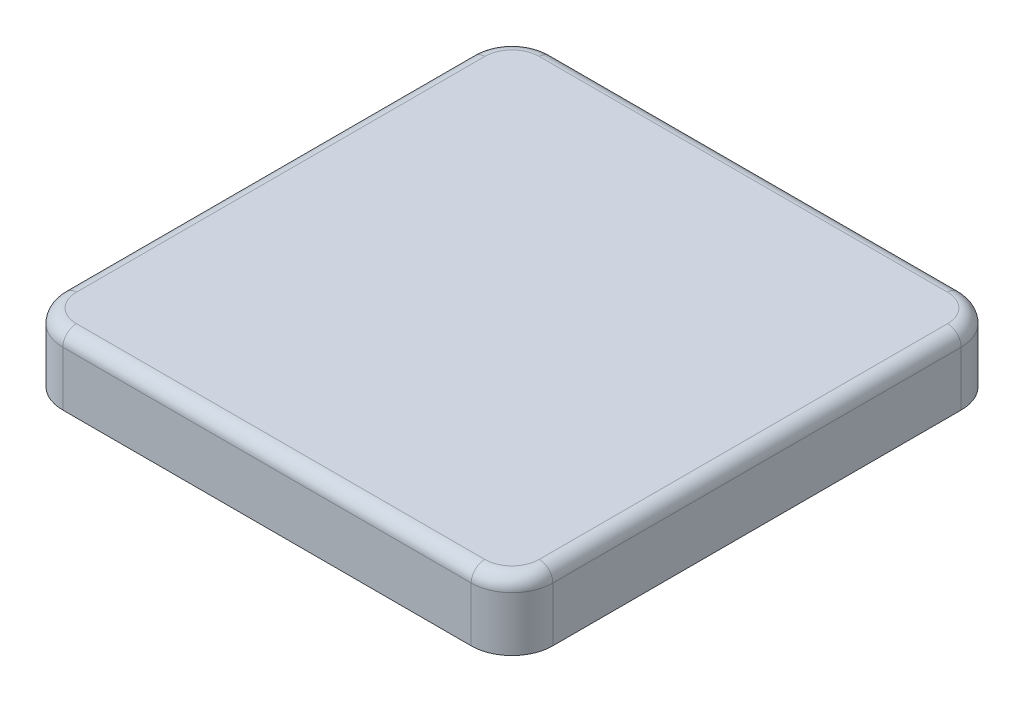
ISO-10303-21;
HEADER;
FILE_DESCRIPTION(('STEP AP214'),'2;1');
FILE_NAME('part.step','',(''),(''),'','','');
FILE_SCHEMA(('AUTOMOTIVE_DESIGN { 1 0 10303 214 1 1 1 1 }'));
ENDSEC;
DATA;
#1=APPLICATION_CONTEXT('core data for automotive mechanical design processes');
#2=APPLICATION_PROTOCOL_DEFINITION('international standard','automotive_design',2000,#1);
#3=PRODUCT_CONTEXT('',#1,'mechanical');
#4=PRODUCT('Part','Part','',(#3));
#5=PRODUCT_RELATED_PRODUCT_CATEGORY('part','',(#4));
#6=PRODUCT_DEFINITION_FORMATION('','',#4);
#7=PRODUCT_DEFINITION_CONTEXT('part definition',#1,'design');
#8=PRODUCT_DEFINITION('design','',#6,#7);
#9=PRODUCT_DEFINITION_SHAPE('','',#8);
#10=(LENGTH_UNIT() NAMED_UNIT(*) SI_UNIT(.MILLI.,.METRE.));
#11=(NAMED_UNIT(*) PLANE_ANGLE_UNIT() SI_UNIT($,.RADIAN.));
#12=(NAMED_UNIT(*) SI_UNIT($,.STERADIAN.) SOLID_ANGLE_UNIT());
#13=UNCERTAINTY_MEASURE_WITH_UNIT(LENGTH_MEASURE(1.E-05),#10,'distance_accuracy_value','');
#14=(GEOMETRIC_REPRESENTATION_CONTEXT(3) GLOBAL_UNCERTAINTY_ASSIGNED_CONTEXT((#13)) GLOBAL_UNIT_ASSIGNED_CONTEXT((#10,
#11,#12)) REPRESENTATION_CONTEXT('',''));
#15=CARTESIAN_POINT('',(0.,0.,0.));
#16=DIRECTION('',(0.,0.,1.));
#17=DIRECTION('',(1.,0.,0.));
#18=AXIS2_PLACEMENT_3D('',#15,#16,#17);
#19=CARTESIAN_POINT('',(-15.,0.,15.));
#20=DIRECTION('',(0.,-1.,0.));
#21=DIRECTION('',(0.,0.,-1.));
#22=AXIS2_PLACEMENT_3D('',#19,#20,#21);
#23=PLANE('',#22);
#24=CARTESIAN_POINT('',(-15.,0.,15.));
#25=DIRECTION('',(0.,1.,0.));
#26=DIRECTION('',(0.,0.,-1.));
#27=AXIS2_PLACEMENT_3D('',#24,#25,#26);
#28=CIRCLE('',#27,3.);
#29=CARTESIAN_POINT('',(-18.,0.,15.));
#30=VERTEX_POINT('',#29);
#31=CARTESIAN_POINT('',(-15.,0.,18.));
#32=VERTEX_POINT('',#31);
#33=EDGE_CURVE('E205',#30,#32,#28,.T.);
#34=ORIENTED_EDGE('',*,*,#33,.F.);
#35=DIRECTION('',(0.,0.,1.));
#36=VECTOR('',#35,1.);
#37=CARTESIAN_POINT('',(-18.,0.,15.));
#38=LINE('',#37,#36);
#39=CARTESIAN_POINT('',(-18.,0.,-15.));
#40=VERTEX_POINT('',#39);
#41=EDGE_CURVE('E275',#40,#30,#38,.T.);
#42=ORIENTED_EDGE('',*,*,#41,.F.);
#43=CARTESIAN_POINT('',(-15.,0.,-15.));
#44=DIRECTION('',(0.,1.,0.));
#45=DIRECTION('',(0.,0.,-1.));
#46=AXIS2_PLACEMENT_3D('',#43,#44,#45);
#47=CIRCLE('',#46,3.);
#48=CARTESIAN_POINT('',(-15.,0.,-18.));
#49=VERTEX_POINT('',#48);
#50=EDGE_CURVE('E267',#49,#40,#47,.T.);
#51=ORIENTED_EDGE('',*,*,#50,.F.);
#52=DIRECTION('',(-1.,0.,0.));
#53=VECTOR('',#52,1.);
#54=CARTESIAN_POINT('',(-15.,0.,-18.));
#55=LINE('',#54,#53);
#56=CARTESIAN_POINT('',(15.,0.,-18.));
#57=VERTEX_POINT('',#56);
#58=EDGE_CURVE('E266',#57,#49,#55,.T.);
#59=ORIENTED_EDGE('',*,*,#58,.F.);
#60=CARTESIAN_POINT('',(15.,0.,-15.));
#61=DIRECTION('',(0.,1.,0.));
#62=DIRECTION('',(0.,0.,-1.));
#63=AXIS2_PLACEMENT_3D('',#60,#61,#62);
#64=CIRCLE('',#63,3.);
#65=CARTESIAN_POINT('',(18.,0.,-15.));
#66=VERTEX_POINT('',#65);
#67=EDGE_CURVE('E263',#66,#57,#64,.T.);
#68=ORIENTED_EDGE('',*,*,#67,.F.);
#69=DIRECTION('',(0.,0.,-1.));
#70=VECTOR('',#69,1.);
#71=CARTESIAN_POINT('',(18.,0.,15.));
#72=LINE('',#71,#70);
#73=CARTESIAN_POINT('',(18.,0.,15.));
#74=VERTEX_POINT('',#73);
#75=EDGE_CURVE('E257',#74,#66,#72,.T.);
#76=ORIENTED_EDGE('',*,*,#75,.F.);
#77=CARTESIAN_POINT('',(15.,0.,15.));
#78=DIRECTION('',(0.,1.,0.));
#79=DIRECTION('',(0.,0.,1.));
#80=AXIS2_PLACEMENT_3D('',#77,#78,#79);
#81=CIRCLE('',#80,3.);
#82=CARTESIAN_POINT('',(15.,0.,18.));
#83=VERTEX_POINT('',#82);
#84=EDGE_CURVE('E260',#83,#74,#81,.T.);
#85=ORIENTED_EDGE('',*,*,#84,.F.);
#86=DIRECTION('',(1.,0.,0.));
#87=VECTOR('',#86,1.);
#88=CARTESIAN_POINT('',(-15.,0.,18.));
#89=LINE('',#88,#87);
#90=EDGE_CURVE('E206',#32,#83,#89,.T.);
#91=ORIENTED_EDGE('',*,*,#90,.F.);
#92=EDGE_LOOP('',(#34,#42,#51,#59,#68,#76,#85,#91));
#93=FACE_BOUND('',#92,.T.);
#94=DIRECTION('',(0.,0.,1.));
#95=VECTOR('',#94,1.);
#96=CARTESIAN_POINT('',(-16.,0.,15.));
#97=LINE('',#96,#95);
#98=CARTESIAN_POINT('',(-16.,0.,-15.));
#99=VERTEX_POINT('',#98);
#100=CARTESIAN_POINT('',(-16.,0.,15.));
#101=VERTEX_POINT('',#100);
#102=EDGE_CURVE('E197',#99,#101,#97,.T.);
#103=ORIENTED_EDGE('',*,*,#102,.T.);
#104=CARTESIAN_POINT('',(-15.,0.,15.));
#105=DIRECTION('',(0.,-1.,0.));
#106=DIRECTION('',(0.,0.,-1.));
#107=AXIS2_PLACEMENT_3D('',#104,#105,#106);
#108=CIRCLE('',#107,0.999999999999999);
#109=CARTESIAN_POINT('',(-15.,0.,16.));
#110=VERTEX_POINT('',#109);
#111=EDGE_CURVE('E233',#101,#110,#108,.F.);
#112=ORIENTED_EDGE('',*,*,#111,.T.);
#113=DIRECTION('',(1.,0.,0.));
#114=VECTOR('',#113,1.);
#115=CARTESIAN_POINT('',(-15.,0.,16.));
#116=LINE('',#115,#114);
#117=CARTESIAN_POINT('',(15.,0.,16.));
#118=VERTEX_POINT('',#117);
#119=EDGE_CURVE('E203',#110,#118,#116,.T.);
#120=ORIENTED_EDGE('',*,*,#119,.T.);
#121=CARTESIAN_POINT('',(15.,0.,15.));
#122=DIRECTION('',(0.,-1.,0.));
#123=DIRECTION('',(0.,0.,-1.));
#124=AXIS2_PLACEMENT_3D('',#121,#122,#123);
#125=CIRCLE('',#124,0.999999999999999);
#126=CARTESIAN_POINT('',(16.,0.,15.));
#127=VERTEX_POINT('',#126);
#128=EDGE_CURVE('E253',#118,#127,#125,.F.);
#129=ORIENTED_EDGE('',*,*,#128,.T.);
#130=DIRECTION('',(0.,0.,-1.));
#131=VECTOR('',#130,1.);
#132=CARTESIAN_POINT('',(16.,0.,15.));
#133=LINE('',#132,#131);
#134=CARTESIAN_POINT('',(16.,0.,-15.));
#135=VERTEX_POINT('',#134);
#136=EDGE_CURVE('E249',#127,#135,#133,.T.);
#137=ORIENTED_EDGE('',*,*,#136,.T.);
#138=CARTESIAN_POINT('',(15.,0.,-15.));
#139=DIRECTION('',(0.,-1.,0.));
#140=DIRECTION('',(0.,0.,-1.));
#141=AXIS2_PLACEMENT_3D('',#138,#139,#140);
#142=CIRCLE('',#141,0.999999999999999);
#143=CARTESIAN_POINT('',(15.,0.,-16.));
#144=VERTEX_POINT('',#143);
#145=EDGE_CURVE('E244',#135,#144,#142,.F.);
#146=ORIENTED_EDGE('',*,*,#145,.T.);
#147=DIRECTION('',(-1.,0.,0.));
#148=VECTOR('',#147,1.);
#149=CARTESIAN_POINT('',(-15.,0.,-16.));
#150=LINE('',#149,#148);
#151=CARTESIAN_POINT('',(-15.,0.,-16.));
#152=VERTEX_POINT('',#151);
#153=EDGE_CURVE('E245',#144,#152,#150,.T.);
#154=ORIENTED_EDGE('',*,*,#153,.T.);
#155=CARTESIAN_POINT('',(-15.,0.,-15.));
#156=DIRECTION('',(0.,-1.,0.));
#157=DIRECTION('',(0.,0.,-1.));
#158=AXIS2_PLACEMENT_3D('',#155,#156,#157);
#159=CIRCLE('',#158,0.999999999999999);
#160=EDGE_CURVE('E239',#152,#99,#159,.F.);
#161=ORIENTED_EDGE('',*,*,#160,.T.);
#162=EDGE_LOOP('',(#103,#112,#120,#129,#137,#146,#154,#161));
#163=FACE_BOUND('',#162,.T.);
#164=ADVANCED_FACE('F39',(#93,#163),#23,.T.);
#165=CARTESIAN_POINT('',(-15.,5.,15.));
#166=DIRECTION('',(0.,-1.,0.));
#167=DIRECTION('',(0.,0.,-1.));
#168=AXIS2_PLACEMENT_3D('',#165,#166,#167);
#169=CYLINDRICAL_SURFACE('',#168,3.);
#170=DIRECTION('',(0.,-1.,0.));
#171=VECTOR('',#170,1.);
#172=CARTESIAN_POINT('',(-15.,5.,18.));
#173=LINE('',#172,#171);
#174=CARTESIAN_POINT('',(-15.,4.,18.));
#175=VERTEX_POINT('',#174);
#176=EDGE_CURVE('E286',#175,#32,#173,.T.);
#177=ORIENTED_EDGE('',*,*,#176,.F.);
#178=CARTESIAN_POINT('',(-15.,4.,15.));
#179=DIRECTION('',(0.,-1.,0.));
#180=DIRECTION('',(0.,0.,-1.));
#181=AXIS2_PLACEMENT_3D('',#178,#179,#180);
#182=CIRCLE('',#181,3.);
#183=CARTESIAN_POINT('',(-18.,4.,15.));
#184=VERTEX_POINT('',#183);
#185=EDGE_CURVE('E11',#175,#184,#182,.T.);
#186=ORIENTED_EDGE('',*,*,#185,.T.);
#187=DIRECTION('',(0.,-1.,0.));
#188=VECTOR('',#187,1.);
#189=CARTESIAN_POINT('',(-18.,5.,15.));
#190=LINE('',#189,#188);
#191=EDGE_CURVE('E274',#184,#30,#190,.T.);
#192=ORIENTED_EDGE('',*,*,#191,.T.);
#193=ORIENTED_EDGE('',*,*,#33,.T.);
#194=EDGE_LOOP('',(#177,#186,#192,#193));
#195=FACE_BOUND('',#194,.T.);
#196=ADVANCED_FACE('F397',(#195),#169,.T.);
#197=CARTESIAN_POINT('',(-15.,5.,18.));
#198=DIRECTION('',(0.,0.,-1.));
#199=DIRECTION('',(-1.,0.,0.));
#200=AXIS2_PLACEMENT_3D('',#197,#198,#199);
#201=PLANE('',#200);
#202=DIRECTION('',(0.,-1.,0.));
#203=VECTOR('',#202,1.);
#204=CARTESIAN_POINT('',(15.,5.,18.));
#205=LINE('',#204,#203);
#206=CARTESIAN_POINT('',(15.,4.,18.));
#207=VERTEX_POINT('',#206);
#208=EDGE_CURVE('E290',#207,#83,#205,.T.);
#209=ORIENTED_EDGE('',*,*,#208,.F.);
#210=DIRECTION('',(1.,0.,0.));
#211=VECTOR('',#210,1.);
#212=CARTESIAN_POINT('',(-15.,4.,18.));
#213=LINE('',#212,#211);
#214=EDGE_CURVE('E48',#207,#175,#213,.F.);
#215=ORIENTED_EDGE('',*,*,#214,.T.);
#216=ORIENTED_EDGE('',*,*,#176,.T.);
#217=ORIENTED_EDGE('',*,*,#90,.T.);
#218=EDGE_LOOP('',(#209,#215,#216,#217));
#219=FACE_BOUND('',#218,.T.);
#220=ADVANCED_FACE('F421',(#219),#201,.F.);
#221=CARTESIAN_POINT('',(15.,5.,15.));
#222=DIRECTION('',(0.,-1.,0.));
#223=DIRECTION('',(0.,0.,-1.));
#224=AXIS2_PLACEMENT_3D('',#221,#222,#223);
#225=CYLINDRICAL_SURFACE('',#224,3.);
#226=DIRECTION('',(0.,-1.,0.));
#227=VECTOR('',#226,1.);
#228=CARTESIAN_POINT('',(18.,5.,15.));
#229=LINE('',#228,#227);
#230=CARTESIAN_POINT('',(18.,4.,15.));
#231=VERTEX_POINT('',#230);
#232=EDGE_CURVE('E284',#231,#74,#229,.T.);
#233=ORIENTED_EDGE('',*,*,#232,.F.);
#234=CARTESIAN_POINT('',(15.,4.,15.));
#235=DIRECTION('',(0.,-1.,0.));
#236=DIRECTION('',(0.,0.,-1.));
#237=AXIS2_PLACEMENT_3D('',#234,#235,#236);
#238=CIRCLE('',#237,3.);
#239=EDGE_CURVE('E62',#231,#207,#238,.T.);
#240=ORIENTED_EDGE('',*,*,#239,.T.);
#241=ORIENTED_EDGE('',*,*,#208,.T.);
#242=ORIENTED_EDGE('',*,*,#84,.T.);
#243=EDGE_LOOP('',(#233,#240,#241,#242));
#244=FACE_BOUND('',#243,.T.);
#245=ADVANCED_FACE('F353',(#244),#225,.T.);
#246=CARTESIAN_POINT('',(18.,5.,15.));
#247=DIRECTION('',(-1.,0.,0.));
#248=DIRECTION('',(0.,0.,1.));
#249=AXIS2_PLACEMENT_3D('',#246,#247,#248);
#250=PLANE('',#249);
#251=DIRECTION('',(0.,-1.,0.));
#252=VECTOR('',#251,1.);
#253=CARTESIAN_POINT('',(18.,5.,-15.));
#254=LINE('',#253,#252);
#255=CARTESIAN_POINT('',(18.,4.,-15.));
#256=VERTEX_POINT('',#255);
#257=EDGE_CURVE('E282',#256,#66,#254,.T.);
#258=ORIENTED_EDGE('',*,*,#257,.F.);
#259=DIRECTION('',(0.,0.,-1.));
#260=VECTOR('',#259,1.);
#261=CARTESIAN_POINT('',(18.,4.,15.));
#262=LINE('',#261,#260);
#263=EDGE_CURVE('E320',#256,#231,#262,.F.);
#264=ORIENTED_EDGE('',*,*,#263,.T.);
#265=ORIENTED_EDGE('',*,*,#232,.T.);
#266=ORIENTED_EDGE('',*,*,#75,.T.);
#267=EDGE_LOOP('',(#258,#264,#265,#266));
#268=FACE_BOUND('',#267,.T.);
#269=ADVANCED_FACE('F352',(#268),#250,.F.);
#270=CARTESIAN_POINT('',(15.,5.,-15.));
#271=DIRECTION('',(0.,-1.,0.));
#272=DIRECTION('',(0.,0.,-1.));
#273=AXIS2_PLACEMENT_3D('',#270,#271,#272);
#274=CYLINDRICAL_SURFACE('',#273,3.);
#275=DIRECTION('',(0.,-1.,0.));
#276=VECTOR('',#275,1.);
#277=CARTESIAN_POINT('',(15.,5.,-18.));
#278=LINE('',#277,#276);
#279=CARTESIAN_POINT('',(15.,4.,-18.));
#280=VERTEX_POINT('',#279);
#281=EDGE_CURVE('E281',#280,#57,#278,.T.);
#282=ORIENTED_EDGE('',*,*,#281,.F.);
#283=CARTESIAN_POINT('',(15.,4.,-15.));
#284=DIRECTION('',(0.,-1.,0.));
#285=DIRECTION('',(0.,0.,-1.));
#286=AXIS2_PLACEMENT_3D('',#283,#284,#285);
#287=CIRCLE('',#286,3.);
#288=EDGE_CURVE('E312',#280,#256,#287,.T.);
#289=ORIENTED_EDGE('',*,*,#288,.T.);
#290=ORIENTED_EDGE('',*,*,#257,.T.);
#291=ORIENTED_EDGE('',*,*,#67,.T.);
#292=EDGE_LOOP('',(#282,#289,#290,#291));
#293=FACE_BOUND('',#292,.T.);
#294=ADVANCED_FACE('F368',(#293),#274,.T.);
#295=CARTESIAN_POINT('',(-15.,5.,-18.));
#296=DIRECTION('',(0.,0.,1.));
#297=DIRECTION('',(1.,0.,0.));
#298=AXIS2_PLACEMENT_3D('',#295,#296,#297);
#299=PLANE('',#298);
#300=DIRECTION('',(0.,-1.,0.));
#301=VECTOR('',#300,1.);
#302=CARTESIAN_POINT('',(-15.,5.,-18.));
#303=LINE('',#302,#301);
#304=CARTESIAN_POINT('',(-15.,4.,-18.));
#305=VERTEX_POINT('',#304);
#306=EDGE_CURVE('E276',#305,#49,#303,.T.);
#307=ORIENTED_EDGE('',*,*,#306,.F.);
#308=DIRECTION('',(-1.,0.,0.));
#309=VECTOR('',#308,1.);
#310=CARTESIAN_POINT('',(-15.,4.,-18.));
#311=LINE('',#310,#309);
#312=EDGE_CURVE('E311',#305,#280,#311,.F.);
#313=ORIENTED_EDGE('',*,*,#312,.T.);
#314=ORIENTED_EDGE('',*,*,#281,.T.);
#315=ORIENTED_EDGE('',*,*,#58,.T.);
#316=EDGE_LOOP('',(#307,#313,#314,#315));
#317=FACE_BOUND('',#316,.T.);
#318=ADVANCED_FACE('F369',(#317),#299,.F.);
#319=CARTESIAN_POINT('',(-15.,5.,-15.));
#320=DIRECTION('',(0.,-1.,0.));
#321=DIRECTION('',(0.,0.,-1.));
#322=AXIS2_PLACEMENT_3D('',#319,#320,#321);
#323=CYLINDRICAL_SURFACE('',#322,3.);
#324=DIRECTION('',(0.,-1.,0.));
#325=VECTOR('',#324,1.);
#326=CARTESIAN_POINT('',(-18.,5.,-15.));
#327=LINE('',#326,#325);
#328=CARTESIAN_POINT('',(-18.,4.,-15.));
#329=VERTEX_POINT('',#328);
#330=EDGE_CURVE('E280',#329,#40,#327,.T.);
#331=ORIENTED_EDGE('',*,*,#330,.F.);
#332=CARTESIAN_POINT('',(-15.,4.,-15.));
#333=DIRECTION('',(0.,-1.,0.));
#334=DIRECTION('',(0.,0.,-1.));
#335=AXIS2_PLACEMENT_3D('',#332,#333,#334);
#336=CIRCLE('',#335,3.);
#337=EDGE_CURVE('E313',#329,#305,#336,.T.);
#338=ORIENTED_EDGE('',*,*,#337,.T.);
#339=ORIENTED_EDGE('',*,*,#306,.T.);
#340=ORIENTED_EDGE('',*,*,#50,.T.);
#341=EDGE_LOOP('',(#331,#338,#339,#340));
#342=FACE_BOUND('',#341,.T.);
#343=ADVANCED_FACE('F427',(#342),#323,.T.);
#344=CARTESIAN_POINT('',(-18.,5.,15.));
#345=DIRECTION('',(1.,0.,0.));
#346=DIRECTION('',(0.,0.,-1.));
#347=AXIS2_PLACEMENT_3D('',#344,#345,#346);
#348=PLANE('',#347);
#349=ORIENTED_EDGE('',*,*,#191,.F.);
#350=DIRECTION('',(0.,0.,1.));
#351=VECTOR('',#350,1.);
#352=CARTESIAN_POINT('',(-18.,4.,15.));
#353=LINE('',#352,#351);
#354=EDGE_CURVE('E306',#184,#329,#353,.F.);
#355=ORIENTED_EDGE('',*,*,#354,.T.);
#356=ORIENTED_EDGE('',*,*,#330,.T.);
#357=ORIENTED_EDGE('',*,*,#41,.T.);
#358=EDGE_LOOP('',(#349,#355,#356,#357));
#359=FACE_BOUND('',#358,.T.);
#360=ADVANCED_FACE('F396',(#359),#348,.F.);
#361=CARTESIAN_POINT('',(-15.,5.,15.));
#362=DIRECTION('',(0.,-1.,0.));
#363=DIRECTION('',(0.,0.,-1.));
#364=AXIS2_PLACEMENT_3D('',#361,#362,#363);
#365=PLANE('',#364);
#366=CARTESIAN_POINT('',(-15.,5.,-15.));
#367=DIRECTION('',(0.,-1.,0.));
#368=DIRECTION('',(0.,0.,-1.));
#369=AXIS2_PLACEMENT_3D('',#366,#367,#368);
#370=CIRCLE('',#369,2.);
#371=CARTESIAN_POINT('',(-15.,5.,-17.));
#372=VERTEX_POINT('',#371);
#373=CARTESIAN_POINT('',(-17.,5.,-15.));
#374=VERTEX_POINT('',#373);
#375=EDGE_CURVE('E304',#372,#374,#370,.F.);
#376=ORIENTED_EDGE('',*,*,#375,.T.);
#377=DIRECTION('',(0.,0.,1.));
#378=VECTOR('',#377,1.);
#379=CARTESIAN_POINT('',(-17.,5.,15.));
#380=LINE('',#379,#378);
#381=CARTESIAN_POINT('',(-17.,5.,15.));
#382=VERTEX_POINT('',#381);
#383=EDGE_CURVE('E303',#374,#382,#380,.T.);
#384=ORIENTED_EDGE('',*,*,#383,.T.);
#385=CARTESIAN_POINT('',(-15.,5.,15.));
#386=DIRECTION('',(0.,-1.,0.));
#387=DIRECTION('',(0.,0.,-1.));
#388=AXIS2_PLACEMENT_3D('',#385,#386,#387);
#389=CIRCLE('',#388,2.);
#390=CARTESIAN_POINT('',(-15.,5.,17.));
#391=VERTEX_POINT('',#390);
#392=EDGE_CURVE('E292',#382,#391,#389,.F.);
#393=ORIENTED_EDGE('',*,*,#392,.T.);
#394=DIRECTION('',(1.,0.,0.));
#395=VECTOR('',#394,1.);
#396=CARTESIAN_POINT('',(-15.,5.,17.));
#397=LINE('',#396,#395);
#398=CARTESIAN_POINT('',(15.,5.,17.));
#399=VERTEX_POINT('',#398);
#400=EDGE_CURVE('E291',#391,#399,#397,.T.);
#401=ORIENTED_EDGE('',*,*,#400,.T.);
#402=CARTESIAN_POINT('',(15.,5.,15.));
#403=DIRECTION('',(0.,-1.,0.));
#404=DIRECTION('',(0.,0.,-1.));
#405=AXIS2_PLACEMENT_3D('',#402,#403,#404);
#406=CIRCLE('',#405,2.);
#407=CARTESIAN_POINT('',(17.,5.,15.));
#408=VERTEX_POINT('',#407);
#409=EDGE_CURVE('E293',#399,#408,#406,.F.);
#410=ORIENTED_EDGE('',*,*,#409,.T.);
#411=DIRECTION('',(0.,0.,-1.));
#412=VECTOR('',#411,1.);
#413=CARTESIAN_POINT('',(17.,5.,15.));
#414=LINE('',#413,#412);
#415=CARTESIAN_POINT('',(17.,5.,-15.));
#416=VERTEX_POINT('',#415);
#417=EDGE_CURVE('E300',#408,#416,#414,.T.);
#418=ORIENTED_EDGE('',*,*,#417,.T.);
#419=CARTESIAN_POINT('',(15.,5.,-15.));
#420=DIRECTION('',(0.,-1.,0.));
#421=DIRECTION('',(0.,0.,-1.));
#422=AXIS2_PLACEMENT_3D('',#419,#420,#421);
#423=CIRCLE('',#422,2.);
#424=CARTESIAN_POINT('',(15.,5.,-17.));
#425=VERTEX_POINT('',#424);
#426=EDGE_CURVE('E298',#416,#425,#423,.F.);
#427=ORIENTED_EDGE('',*,*,#426,.T.);
#428=DIRECTION('',(-1.,0.,0.));
#429=VECTOR('',#428,1.);
#430=CARTESIAN_POINT('',(-15.,5.,-17.));
#431=LINE('',#430,#429);
#432=EDGE_CURVE('E302',#425,#372,#431,.T.);
#433=ORIENTED_EDGE('',*,*,#432,.T.);
#434=EDGE_LOOP('',(#376,#384,#393,#401,#410,#418,#427,#433));
#435=FACE_BOUND('',#434,.T.);
#436=ADVANCED_FACE('F385',(#435),#365,.F.);
#437=CARTESIAN_POINT('',(-15.,5.,15.));
#438=DIRECTION('',(0.,-1.,0.));
#439=DIRECTION('',(0.,0.,-1.));
#440=AXIS2_PLACEMENT_3D('',#437,#438,#439);
#441=CYLINDRICAL_SURFACE('',#440,0.999999999999999);
#442=ORIENTED_EDGE('',*,*,#111,.F.);
#443=DIRECTION('',(0.,-1.,0.));
#444=VECTOR('',#443,1.);
#445=CARTESIAN_POINT('',(-16.,5.,15.));
#446=LINE('',#445,#444);
#447=CARTESIAN_POINT('',(-16.,3.,15.));
#448=VERTEX_POINT('',#447);
#449=EDGE_CURVE('E198',#448,#101,#446,.T.);
#450=ORIENTED_EDGE('',*,*,#449,.F.);
#451=CARTESIAN_POINT('',(-15.,3.,15.));
#452=DIRECTION('',(0.,-1.,0.));
#453=DIRECTION('',(0.,0.,-1.));
#454=AXIS2_PLACEMENT_3D('',#451,#452,#453);
#455=CIRCLE('',#454,0.999999999999999);
#456=CARTESIAN_POINT('',(-15.,3.,16.));
#457=VERTEX_POINT('',#456);
#458=EDGE_CURVE('E182',#448,#457,#455,.F.);
#459=ORIENTED_EDGE('',*,*,#458,.T.);
#460=DIRECTION('',(0.,1.,0.));
#461=VECTOR('',#460,1.);
#462=CARTESIAN_POINT('',(-15.,5.,16.));
#463=LINE('',#462,#461);
#464=EDGE_CURVE('E191',#457,#110,#463,.F.);
#465=ORIENTED_EDGE('',*,*,#464,.T.);
#466=EDGE_LOOP('',(#442,#450,#459,#465));
#467=FACE_BOUND('',#466,.T.);
#468=ADVANCED_FACE('F194',(#467),#441,.F.);
#469=CARTESIAN_POINT('',(-15.,5.,16.));
#470=DIRECTION('',(0.,0.,-1.));
#471=DIRECTION('',(-1.,0.,0.));
#472=AXIS2_PLACEMENT_3D('',#469,#470,#471);
#473=PLANE('',#472);
#474=ORIENTED_EDGE('',*,*,#119,.F.);
#475=ORIENTED_EDGE('',*,*,#464,.F.);
#476=DIRECTION('',(1.,0.,0.));
#477=VECTOR('',#476,1.);
#478=CARTESIAN_POINT('',(-15.,3.,16.));
#479=LINE('',#478,#477);
#480=CARTESIAN_POINT('',(15.,3.,16.));
#481=VERTEX_POINT('',#480);
#482=EDGE_CURVE('E180',#457,#481,#479,.T.);
#483=ORIENTED_EDGE('',*,*,#482,.T.);
#484=DIRECTION('',(0.,-1.,0.));
#485=VECTOR('',#484,1.);
#486=CARTESIAN_POINT('',(15.,5.,16.));
#487=LINE('',#486,#485);
#488=EDGE_CURVE('E201',#481,#118,#487,.T.);
#489=ORIENTED_EDGE('',*,*,#488,.T.);
#490=EDGE_LOOP('',(#474,#475,#483,#489));
#491=FACE_BOUND('',#490,.T.);
#492=ADVANCED_FACE('F200',(#491),#473,.T.);
#493=CARTESIAN_POINT('',(15.,5.,15.));
#494=DIRECTION('',(0.,-1.,0.));
#495=DIRECTION('',(0.,0.,-1.));
#496=AXIS2_PLACEMENT_3D('',#493,#494,#495);
#497=CYLINDRICAL_SURFACE('',#496,0.999999999999999);
#498=ORIENTED_EDGE('',*,*,#128,.F.);
#499=ORIENTED_EDGE('',*,*,#488,.F.);
#500=CARTESIAN_POINT('',(15.,3.,15.));
#501=DIRECTION('',(0.,-1.,0.));
#502=DIRECTION('',(0.,0.,-1.));
#503=AXIS2_PLACEMENT_3D('',#500,#501,#502);
#504=CIRCLE('',#503,0.999999999999999);
#505=CARTESIAN_POINT('',(16.,3.,15.));
#506=VERTEX_POINT('',#505);
#507=EDGE_CURVE('E181',#481,#506,#504,.F.);
#508=ORIENTED_EDGE('',*,*,#507,.T.);
#509=DIRECTION('',(0.,1.,0.));
#510=VECTOR('',#509,1.);
#511=CARTESIAN_POINT('',(16.,5.,15.));
#512=LINE('',#511,#510);
#513=EDGE_CURVE('E208',#506,#127,#512,.F.);
#514=ORIENTED_EDGE('',*,*,#513,.T.);
#515=EDGE_LOOP('',(#498,#499,#508,#514));
#516=FACE_BOUND('',#515,.T.);
#517=ADVANCED_FACE('F557',(#516),#497,.F.);
#518=CARTESIAN_POINT('',(16.,5.,15.));
#519=DIRECTION('',(-1.,0.,0.));
#520=DIRECTION('',(0.,0.,1.));
#521=AXIS2_PLACEMENT_3D('',#518,#519,#520);
#522=PLANE('',#521);
#523=ORIENTED_EDGE('',*,*,#136,.F.);
#524=ORIENTED_EDGE('',*,*,#513,.F.);
#525=DIRECTION('',(0.,0.,-1.));
#526=VECTOR('',#525,1.);
#527=CARTESIAN_POINT('',(16.,3.,15.));
#528=LINE('',#527,#526);
#529=CARTESIAN_POINT('',(16.,3.,-15.));
#530=VERTEX_POINT('',#529);
#531=EDGE_CURVE('E219',#506,#530,#528,.T.);
#532=ORIENTED_EDGE('',*,*,#531,.T.);
#533=DIRECTION('',(0.,-1.,0.));
#534=VECTOR('',#533,1.);
#535=CARTESIAN_POINT('',(16.,5.,-15.));
#536=LINE('',#535,#534);
#537=EDGE_CURVE('E217',#530,#135,#536,.T.);
#538=ORIENTED_EDGE('',*,*,#537,.T.);
#539=EDGE_LOOP('',(#523,#524,#532,#538));
#540=FACE_BOUND('',#539,.T.);
#541=ADVANCED_FACE('F562',(#540),#522,.T.);
#542=CARTESIAN_POINT('',(15.,5.,-15.));
#543=DIRECTION('',(0.,-1.,0.));
#544=DIRECTION('',(0.,0.,-1.));
#545=AXIS2_PLACEMENT_3D('',#542,#543,#544);
#546=CYLINDRICAL_SURFACE('',#545,0.999999999999999);
#547=ORIENTED_EDGE('',*,*,#145,.F.);
#548=ORIENTED_EDGE('',*,*,#537,.F.);
#549=CARTESIAN_POINT('',(15.,3.,-15.));
#550=DIRECTION('',(0.,-1.,0.));
#551=DIRECTION('',(0.,0.,-1.));
#552=AXIS2_PLACEMENT_3D('',#549,#550,#551);
#553=CIRCLE('',#552,0.999999999999999);
#554=CARTESIAN_POINT('',(15.,3.,-16.));
#555=VERTEX_POINT('',#554);
#556=EDGE_CURVE('E221',#530,#555,#553,.F.);
#557=ORIENTED_EDGE('',*,*,#556,.T.);
#558=DIRECTION('',(0.,1.,0.));
#559=VECTOR('',#558,1.);
#560=CARTESIAN_POINT('',(15.,5.,-16.));
#561=LINE('',#560,#559);
#562=EDGE_CURVE('E225',#555,#144,#561,.F.);
#563=ORIENTED_EDGE('',*,*,#562,.T.);
#564=EDGE_LOOP('',(#547,#548,#557,#563));
#565=FACE_BOUND('',#564,.T.);
#566=ADVANCED_FACE('F563',(#565),#546,.F.);
#567=CARTESIAN_POINT('',(-15.,5.,-16.));
#568=DIRECTION('',(0.,0.,1.));
#569=DIRECTION('',(1.,0.,0.));
#570=AXIS2_PLACEMENT_3D('',#567,#568,#569);
#571=PLANE('',#570);
#572=ORIENTED_EDGE('',*,*,#153,.F.);
#573=ORIENTED_EDGE('',*,*,#562,.F.);
#574=DIRECTION('',(-1.,0.,0.));
#575=VECTOR('',#574,1.);
#576=CARTESIAN_POINT('',(-15.,3.,-16.));
#577=LINE('',#576,#575);
#578=CARTESIAN_POINT('',(-15.,3.,-16.));
#579=VERTEX_POINT('',#578);
#580=EDGE_CURVE('E227',#555,#579,#577,.T.);
#581=ORIENTED_EDGE('',*,*,#580,.T.);
#582=DIRECTION('',(0.,-1.,0.));
#583=VECTOR('',#582,1.);
#584=CARTESIAN_POINT('',(-15.,5.,-16.));
#585=LINE('',#584,#583);
#586=EDGE_CURVE('E226',#579,#152,#585,.T.);
#587=ORIENTED_EDGE('',*,*,#586,.T.);
#588=EDGE_LOOP('',(#572,#573,#581,#587));
#589=FACE_BOUND('',#588,.T.);
#590=ADVANCED_FACE('F569',(#589),#571,.T.);
#591=CARTESIAN_POINT('',(-15.,5.,-15.));
#592=DIRECTION('',(0.,-1.,0.));
#593=DIRECTION('',(0.,0.,-1.));
#594=AXIS2_PLACEMENT_3D('',#591,#592,#593);
#595=CYLINDRICAL_SURFACE('',#594,0.999999999999999);
#596=ORIENTED_EDGE('',*,*,#160,.F.);
#597=ORIENTED_EDGE('',*,*,#586,.F.);
#598=CARTESIAN_POINT('',(-15.,3.,-15.));
#599=DIRECTION('',(0.,-1.,0.));
#600=DIRECTION('',(0.,0.,-1.));
#601=AXIS2_PLACEMENT_3D('',#598,#599,#600);
#602=CIRCLE('',#601,0.999999999999999);
#603=CARTESIAN_POINT('',(-16.,3.,-15.));
#604=VERTEX_POINT('',#603);
#605=EDGE_CURVE('E232',#579,#604,#602,.F.);
#606=ORIENTED_EDGE('',*,*,#605,.T.);
#607=DIRECTION('',(0.,1.,0.));
#608=VECTOR('',#607,1.);
#609=CARTESIAN_POINT('',(-16.,5.,-15.));
#610=LINE('',#609,#608);
#611=EDGE_CURVE('E212',#604,#99,#610,.F.);
#612=ORIENTED_EDGE('',*,*,#611,.T.);
#613=EDGE_LOOP('',(#596,#597,#606,#612));
#614=FACE_BOUND('',#613,.T.);
#615=ADVANCED_FACE('F572',(#614),#595,.F.);
#616=CARTESIAN_POINT('',(-16.,5.,15.));
#617=DIRECTION('',(1.,0.,0.));
#618=DIRECTION('',(0.,0.,-1.));
#619=AXIS2_PLACEMENT_3D('',#616,#617,#618);
#620=PLANE('',#619);
#621=ORIENTED_EDGE('',*,*,#102,.F.);
#622=ORIENTED_EDGE('',*,*,#611,.F.);
#623=DIRECTION('',(0.,0.,1.));
#624=VECTOR('',#623,1.);
#625=CARTESIAN_POINT('',(-16.,3.,15.));
#626=LINE('',#625,#624);
#627=EDGE_CURVE('E214',#604,#448,#626,.T.);
#628=ORIENTED_EDGE('',*,*,#627,.T.);
#629=ORIENTED_EDGE('',*,*,#449,.T.);
#630=EDGE_LOOP('',(#621,#622,#628,#629));
#631=FACE_BOUND('',#630,.T.);
#632=ADVANCED_FACE('F580',(#631),#620,.T.);
#633=CARTESIAN_POINT('',(-15.,3.,15.));
#634=DIRECTION('',(0.,-1.,0.));
#635=DIRECTION('',(0.,0.,-1.));
#636=AXIS2_PLACEMENT_3D('',#633,#634,#635);
#637=PLANE('',#636);
#638=CARTESIAN_POINT('',(0.,3.,0.));
#639=DIRECTION('',(0.,-1.,0.));
#640=DIRECTION('',(0.,0.,-1.));
#641=AXIS2_PLACEMENT_3D('',#638,#639,#640);
#642=CIRCLE('',#641,13.5);
#643=CARTESIAN_POINT('',(0.,3.,-13.5));
#644=VERTEX_POINT('',#643);
#645=EDGE_CURVE('E585',#644,#644,#642,.T.);
#646=ORIENTED_EDGE('',*,*,#645,.F.);
#647=EDGE_LOOP('',(#646));
#648=FACE_BOUND('',#647,.T.);
#649=ORIENTED_EDGE('',*,*,#458,.F.);
#650=ORIENTED_EDGE('',*,*,#627,.F.);
#651=ORIENTED_EDGE('',*,*,#605,.F.);
#652=ORIENTED_EDGE('',*,*,#580,.F.);
#653=ORIENTED_EDGE('',*,*,#556,.F.);
#654=ORIENTED_EDGE('',*,*,#531,.F.);
#655=ORIENTED_EDGE('',*,*,#507,.F.);
#656=ORIENTED_EDGE('',*,*,#482,.F.);
#657=EDGE_LOOP('',(#649,#650,#651,#652,#653,#654,#655,#656));
#658=FACE_BOUND('',#657,.T.);
#659=ADVANCED_FACE('F176',(#648,#658),#637,.T.);
#660=CARTESIAN_POINT('',(17.,4.,15.));
#661=DIRECTION('',(0.,0.,-1.));
#662=DIRECTION('',(-1.,0.,0.));
#663=AXIS2_PLACEMENT_3D('',#660,#661,#662);
#664=CYLINDRICAL_SURFACE('',#663,1.);
#665=CARTESIAN_POINT('',(17.,4.,15.));
#666=DIRECTION('',(0.,0.,1.));
#667=DIRECTION('',(1.,0.,0.));
#668=AXIS2_PLACEMENT_3D('',#665,#666,#667);
#669=CIRCLE('',#668,1.);
#670=EDGE_CURVE('E336',#231,#408,#669,.T.);
#671=ORIENTED_EDGE('',*,*,#670,.F.);
#672=ORIENTED_EDGE('',*,*,#263,.F.);
#673=CARTESIAN_POINT('',(17.,4.,-15.));
#674=DIRECTION('',(0.,0.,-1.));
#675=DIRECTION('',(-1.,0.,0.));
#676=AXIS2_PLACEMENT_3D('',#673,#674,#675);
#677=CIRCLE('',#676,1.);
#678=EDGE_CURVE('E43',#416,#256,#677,.T.);
#679=ORIENTED_EDGE('',*,*,#678,.F.);
#680=ORIENTED_EDGE('',*,*,#417,.F.);
#681=EDGE_LOOP('',(#671,#672,#679,#680));
#682=FACE_BOUND('',#681,.T.);
#683=ADVANCED_FACE('F41',(#682),#664,.T.);
#684=CARTESIAN_POINT('',(15.,4.,-15.));
#685=DIRECTION('',(0.,-1.,0.));
#686=DIRECTION('',(0.,0.,-1.));
#687=AXIS2_PLACEMENT_3D('',#684,#685,#686);
#688=TOROIDAL_SURFACE('',#687,2.,1.);
#689=ORIENTED_EDGE('',*,*,#678,.T.);
#690=ORIENTED_EDGE('',*,*,#288,.F.);
#691=CARTESIAN_POINT('',(15.,4.,-17.));
#692=DIRECTION('',(-1.,0.,0.));
#693=DIRECTION('',(0.,0.,1.));
#694=AXIS2_PLACEMENT_3D('',#691,#692,#693);
#695=CIRCLE('',#694,1.);
#696=EDGE_CURVE('E331',#425,#280,#695,.T.);
#697=ORIENTED_EDGE('',*,*,#696,.F.);
#698=ORIENTED_EDGE('',*,*,#426,.F.);
#699=EDGE_LOOP('',(#689,#690,#697,#698));
#700=FACE_BOUND('',#699,.T.);
#701=ADVANCED_FACE('F347',(#700),#688,.T.);
#702=CARTESIAN_POINT('',(15.,4.,15.));
#703=DIRECTION('',(0.,-1.,0.));
#704=DIRECTION('',(0.,0.,-1.));
#705=AXIS2_PLACEMENT_3D('',#702,#703,#704);
#706=TOROIDAL_SURFACE('',#705,2.,1.);
#707=ORIENTED_EDGE('',*,*,#670,.T.);
#708=ORIENTED_EDGE('',*,*,#409,.F.);
#709=CARTESIAN_POINT('',(15.,4.,17.));
#710=DIRECTION('',(-1.,0.,0.));
#711=DIRECTION('',(0.,0.,1.));
#712=AXIS2_PLACEMENT_3D('',#709,#710,#711);
#713=CIRCLE('',#712,1.);
#714=EDGE_CURVE('E332',#207,#399,#713,.T.);
#715=ORIENTED_EDGE('',*,*,#714,.F.);
#716=ORIENTED_EDGE('',*,*,#239,.F.);
#717=EDGE_LOOP('',(#707,#708,#715,#716));
#718=FACE_BOUND('',#717,.T.);
#719=ADVANCED_FACE('F384',(#718),#706,.T.);
#720=CARTESIAN_POINT('',(-15.,4.,-17.));
#721=DIRECTION('',(-1.,0.,0.));
#722=DIRECTION('',(0.,0.,1.));
#723=AXIS2_PLACEMENT_3D('',#720,#721,#722);
#724=CYLINDRICAL_SURFACE('',#723,1.);
#725=ORIENTED_EDGE('',*,*,#696,.T.);
#726=ORIENTED_EDGE('',*,*,#312,.F.);
#727=CARTESIAN_POINT('',(-15.,4.,-17.));
#728=DIRECTION('',(-1.,0.,0.));
#729=DIRECTION('',(0.,0.,1.));
#730=AXIS2_PLACEMENT_3D('',#727,#728,#729);
#731=CIRCLE('',#730,1.);
#732=EDGE_CURVE('E327',#372,#305,#731,.T.);
#733=ORIENTED_EDGE('',*,*,#732,.F.);
#734=ORIENTED_EDGE('',*,*,#432,.F.);
#735=EDGE_LOOP('',(#725,#726,#733,#734));
#736=FACE_BOUND('',#735,.T.);
#737=ADVANCED_FACE('F373',(#736),#724,.T.);
#738=CARTESIAN_POINT('',(-15.,4.,17.));
#739=DIRECTION('',(1.,0.,0.));
#740=DIRECTION('',(0.,0.,-1.));
#741=AXIS2_PLACEMENT_3D('',#738,#739,#740);
#742=CYLINDRICAL_SURFACE('',#741,1.);
#743=ORIENTED_EDGE('',*,*,#714,.T.);
#744=ORIENTED_EDGE('',*,*,#400,.F.);
#745=CARTESIAN_POINT('',(-15.,4.,17.));
#746=DIRECTION('',(-1.,0.,0.));
#747=DIRECTION('',(0.,0.,1.));
#748=AXIS2_PLACEMENT_3D('',#745,#746,#747);
#749=CIRCLE('',#748,1.);
#750=EDGE_CURVE('E324',#175,#391,#749,.T.);
#751=ORIENTED_EDGE('',*,*,#750,.F.);
#752=ORIENTED_EDGE('',*,*,#214,.F.);
#753=EDGE_LOOP('',(#743,#744,#751,#752));
#754=FACE_BOUND('',#753,.T.);
#755=ADVANCED_FACE('F390',(#754),#742,.T.);
#756=CARTESIAN_POINT('',(-15.,4.,-15.));
#757=DIRECTION('',(0.,-1.,0.));
#758=DIRECTION('',(0.,0.,-1.));
#759=AXIS2_PLACEMENT_3D('',#756,#757,#758);
#760=TOROIDAL_SURFACE('',#759,2.,1.);
#761=ORIENTED_EDGE('',*,*,#732,.T.);
#762=ORIENTED_EDGE('',*,*,#337,.F.);
#763=CARTESIAN_POINT('',(-17.,4.,-15.));
#764=DIRECTION('',(0.,0.,1.));
#765=DIRECTION('',(1.,0.,0.));
#766=AXIS2_PLACEMENT_3D('',#763,#764,#765);
#767=CIRCLE('',#766,1.);
#768=EDGE_CURVE('E323',#374,#329,#767,.T.);
#769=ORIENTED_EDGE('',*,*,#768,.F.);
#770=ORIENTED_EDGE('',*,*,#375,.F.);
#771=EDGE_LOOP('',(#761,#762,#769,#770));
#772=FACE_BOUND('',#771,.T.);
#773=ADVANCED_FACE('F378',(#772),#760,.T.);
#774=CARTESIAN_POINT('',(-15.,4.,15.));
#775=DIRECTION('',(0.,-1.,0.));
#776=DIRECTION('',(0.,0.,-1.));
#777=AXIS2_PLACEMENT_3D('',#774,#775,#776);
#778=TOROIDAL_SURFACE('',#777,2.,1.);
#779=ORIENTED_EDGE('',*,*,#750,.T.);
#780=ORIENTED_EDGE('',*,*,#392,.F.);
#781=CARTESIAN_POINT('',(-17.,4.,15.));
#782=DIRECTION('',(0.,0.,-1.));
#783=DIRECTION('',(0.,1.,0.));
#784=AXIS2_PLACEMENT_3D('',#781,#782,#783);
#785=CIRCLE('',#784,1.);
#786=EDGE_CURVE('E321',#184,#382,#785,.T.);
#787=ORIENTED_EDGE('',*,*,#786,.F.);
#788=ORIENTED_EDGE('',*,*,#185,.F.);
#789=EDGE_LOOP('',(#779,#780,#787,#788));
#790=FACE_BOUND('',#789,.T.);
#791=ADVANCED_FACE('F392',(#790),#778,.T.);
#792=CARTESIAN_POINT('',(-17.,4.,15.));
#793=DIRECTION('',(0.,0.,1.));
#794=DIRECTION('',(1.,0.,0.));
#795=AXIS2_PLACEMENT_3D('',#792,#793,#794);
#796=CYLINDRICAL_SURFACE('',#795,1.);
#797=ORIENTED_EDGE('',*,*,#768,.T.);
#798=ORIENTED_EDGE('',*,*,#354,.F.);
#799=ORIENTED_EDGE('',*,*,#786,.T.);
#800=ORIENTED_EDGE('',*,*,#383,.F.);
#801=EDGE_LOOP('',(#797,#798,#799,#800));
#802=FACE_BOUND('',#801,.T.);
#803=ADVANCED_FACE('F401',(#802),#796,.T.);
#804=CARTESIAN_POINT('',(0.,-38.1837661840736,0.));
#805=DIRECTION('',(0.,1.,0.));
#806=DIRECTION('',(0.,0.,1.));
#807=AXIS2_PLACEMENT_3D('',#804,#805,#806);
#808=CYLINDRICAL_SURFACE('',#807,13.5);
#809=ORIENTED_EDGE('',*,*,#645,.T.);
#810=EDGE_LOOP('',(#809));
#811=FACE_BOUND('',#810,.T.);
#812=CARTESIAN_POINT('',(0.,0.,0.));
#813=DIRECTION('',(0.,-1.,0.));
#814=DIRECTION('',(0.,0.,-1.));
#815=AXIS2_PLACEMENT_3D('',#812,#813,#814);
#816=CIRCLE('',#815,13.5);
#817=CARTESIAN_POINT('',(0.,0.,-13.5));
#818=VERTEX_POINT('',#817);
#819=EDGE_CURVE('E211',#818,#818,#816,.T.);
#820=ORIENTED_EDGE('',*,*,#819,.F.);
#821=EDGE_LOOP('',(#820));
#822=FACE_BOUND('',#821,.T.);
#823=ADVANCED_FACE('F403',(#811,#822),#808,.T.);
#824=CARTESIAN_POINT('',(-15.,0.,15.));
#825=DIRECTION('',(0.,-1.,0.));
#826=DIRECTION('',(0.,0.,-1.));
#827=AXIS2_PLACEMENT_3D('',#824,#825,#826);
#828=PLANE('',#827);
#829=ORIENTED_EDGE('',*,*,#819,.T.);
#830=EDGE_LOOP('',(#829));
#831=FACE_BOUND('',#830,.T.);
#832=ADVANCED_FACE('F415',(#831),#828,.T.);
#833=CLOSED_SHELL('',(#164,#196,#220,#245,#269,#294,#318,#343,#360,#436,#468,#492,#517,#541,
#566,#590,#615,#632,#659,#683,#701,#719,#737,#755,#773,#791,#803,#823,#832));
#834=MANIFOLD_SOLID_BREP('B2',#833);
#835=ADVANCED_BREP_SHAPE_REPRESENTATION('',(#18,#834),#14);
#836=SHAPE_DEFINITION_REPRESENTATION(#9,#835);
ENDSEC;
END-ISO-10303-21;
